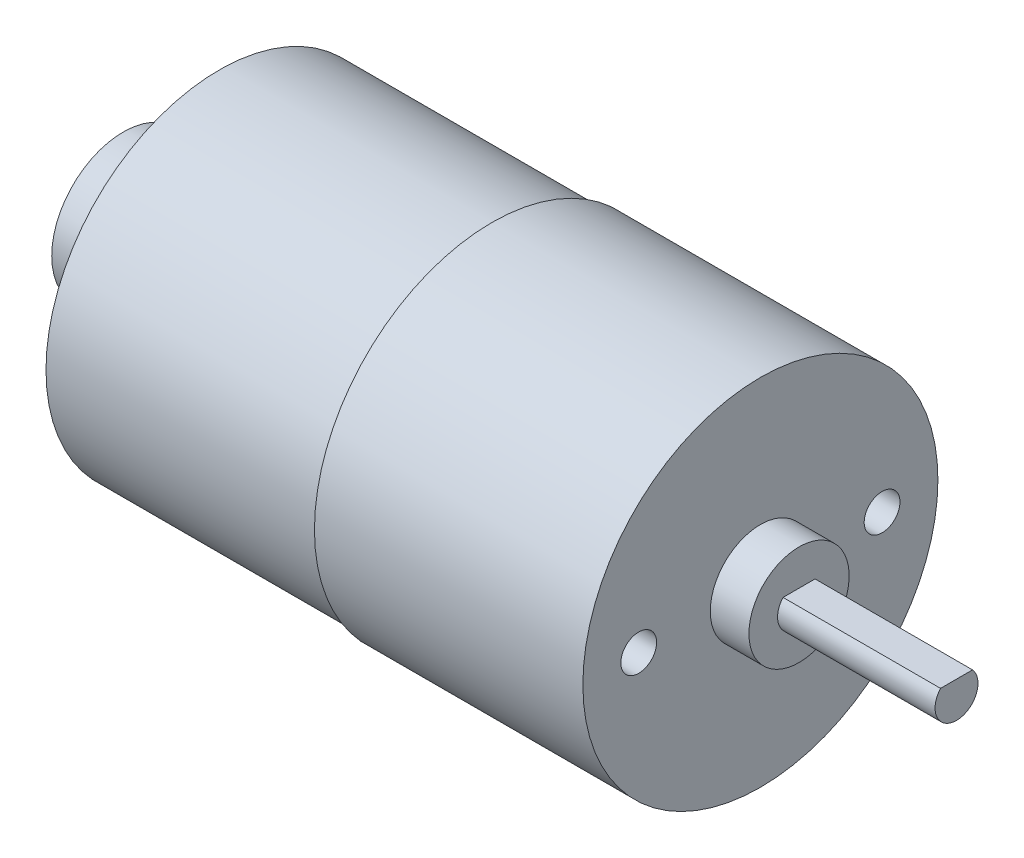
ISO-10303-21;
HEADER;
FILE_DESCRIPTION(('STEP AP214'),'2;1');
FILE_NAME('part.step','',(''),(''),'','','');
FILE_SCHEMA(('AUTOMOTIVE_DESIGN { 1 0 10303 214 1 1 1 1 }'));
ENDSEC;
DATA;
#1=APPLICATION_CONTEXT('core data for automotive mechanical design processes');
#2=APPLICATION_PROTOCOL_DEFINITION('international standard','automotive_design',2000,#1);
#3=PRODUCT_CONTEXT('',#1,'mechanical');
#4=PRODUCT('Part','Part','',(#3));
#5=PRODUCT_RELATED_PRODUCT_CATEGORY('part','',(#4));
#6=PRODUCT_DEFINITION_FORMATION('','',#4);
#7=PRODUCT_DEFINITION_CONTEXT('part definition',#1,'design');
#8=PRODUCT_DEFINITION('design','',#6,#7);
#9=PRODUCT_DEFINITION_SHAPE('','',#8);
#10=(LENGTH_UNIT() NAMED_UNIT(*) SI_UNIT(.MILLI.,.METRE.));
#11=(NAMED_UNIT(*) PLANE_ANGLE_UNIT() SI_UNIT($,.RADIAN.));
#12=(NAMED_UNIT(*) SI_UNIT($,.STERADIAN.) SOLID_ANGLE_UNIT());
#13=UNCERTAINTY_MEASURE_WITH_UNIT(LENGTH_MEASURE(1.E-05),#10,'distance_accuracy_value','');
#14=(GEOMETRIC_REPRESENTATION_CONTEXT(3) GLOBAL_UNCERTAINTY_ASSIGNED_CONTEXT((#13)) GLOBAL_UNIT_ASSIGNED_CONTEXT((#10,
#11,#12)) REPRESENTATION_CONTEXT('',''));
#15=CARTESIAN_POINT('',(0.,0.,0.));
#16=DIRECTION('',(0.,0.,1.));
#17=DIRECTION('',(1.,0.,0.));
#18=AXIS2_PLACEMENT_3D('',#15,#16,#17);
#19=CARTESIAN_POINT('',(37.8,12.4,0.));
#20=DIRECTION('',(-1.,0.,0.));
#21=DIRECTION('',(0.,0.,1.));
#22=AXIS2_PLACEMENT_3D('',#19,#20,#21);
#23=PLANE('',#22);
#24=CARTESIAN_POINT('',(37.8,0.,-8.5));
#25=DIRECTION('',(1.,0.,0.));
#26=DIRECTION('',(0.,0.,-1.));
#27=AXIS2_PLACEMENT_3D('',#24,#25,#26);
#28=CIRCLE('',#27,1.24999999999999);
#29=CARTESIAN_POINT('',(37.8,0.,-9.74999999999999));
#30=VERTEX_POINT('',#29);
#31=EDGE_CURVE('E84',#30,#30,#28,.T.);
#32=ORIENTED_EDGE('',*,*,#31,.F.);
#33=EDGE_LOOP('',(#32));
#34=FACE_BOUND('',#33,.T.);
#35=CARTESIAN_POINT('',(37.8,0.,0.));
#36=DIRECTION('',(-1.,0.,0.));
#37=DIRECTION('',(0.,0.,1.));
#38=AXIS2_PLACEMENT_3D('',#35,#36,#37);
#39=CIRCLE('',#38,12.4);
#40=CARTESIAN_POINT('',(37.8,0.,12.4));
#41=VERTEX_POINT('',#40);
#42=EDGE_CURVE('E100',#41,#41,#39,.T.);
#43=ORIENTED_EDGE('',*,*,#42,.F.);
#44=EDGE_LOOP('',(#43));
#45=FACE_BOUND('',#44,.T.);
#46=CARTESIAN_POINT('',(37.8,0.,0.));
#47=DIRECTION('',(-1.,0.,0.));
#48=DIRECTION('',(0.,0.,1.));
#49=AXIS2_PLACEMENT_3D('',#46,#47,#48);
#50=CIRCLE('',#49,3.5);
#51=CARTESIAN_POINT('',(37.8,0.,3.5));
#52=VERTEX_POINT('',#51);
#53=EDGE_CURVE('E97',#52,#52,#50,.T.);
#54=ORIENTED_EDGE('',*,*,#53,.T.);
#55=EDGE_LOOP('',(#54));
#56=FACE_BOUND('',#55,.T.);
#57=CARTESIAN_POINT('',(37.8,0.,8.5));
#58=DIRECTION('',(1.,0.,0.));
#59=DIRECTION('',(0.,0.,-1.));
#60=AXIS2_PLACEMENT_3D('',#57,#58,#59);
#61=CIRCLE('',#60,1.24999999999999);
#62=CARTESIAN_POINT('',(37.8,0.,7.25000000000001));
#63=VERTEX_POINT('',#62);
#64=EDGE_CURVE('E150',#63,#63,#61,.T.);
#65=ORIENTED_EDGE('',*,*,#64,.F.);
#66=EDGE_LOOP('',(#65));
#67=FACE_BOUND('',#66,.T.);
#68=ADVANCED_FACE('F45',(#34,#45,#56,#67),#23,.F.);
#69=CARTESIAN_POINT('',(0.,0.,0.));
#70=DIRECTION('',(1.,0.,0.));
#71=DIRECTION('',(0.,0.,-1.));
#72=AXIS2_PLACEMENT_3D('',#69,#70,#71);
#73=PLANE('',#72);
#74=CARTESIAN_POINT('',(0.,0.,0.));
#75=DIRECTION('',(-1.,0.,0.));
#76=DIRECTION('',(0.,0.,1.));
#77=AXIS2_PLACEMENT_3D('',#74,#75,#76);
#78=CIRCLE('',#77,5.);
#79=CARTESIAN_POINT('',(0.,0.,5.));
#80=VERTEX_POINT('',#79);
#81=EDGE_CURVE('E11',#80,#80,#78,.T.);
#82=ORIENTED_EDGE('',*,*,#81,.F.);
#83=EDGE_LOOP('',(#82));
#84=FACE_BOUND('',#83,.T.);
#85=CARTESIAN_POINT('',(0.,0.,0.));
#86=DIRECTION('',(-1.,0.,0.));
#87=DIRECTION('',(0.,0.,1.));
#88=AXIS2_PLACEMENT_3D('',#85,#86,#87);
#89=CIRCLE('',#88,12.1);
#90=CARTESIAN_POINT('',(0.,0.,12.1));
#91=VERTEX_POINT('',#90);
#92=EDGE_CURVE('E49',#91,#91,#89,.T.);
#93=ORIENTED_EDGE('',*,*,#92,.T.);
#94=EDGE_LOOP('',(#93));
#95=FACE_BOUND('',#94,.T.);
#96=ADVANCED_FACE('F47',(#84,#95),#73,.F.);
#97=CARTESIAN_POINT('',(0.,0.,0.));
#98=DIRECTION('',(-1.,0.,0.));
#99=DIRECTION('',(0.,0.,1.));
#100=AXIS2_PLACEMENT_3D('',#97,#98,#99);
#101=CYLINDRICAL_SURFACE('',#100,12.1);
#102=ORIENTED_EDGE('',*,*,#92,.F.);
#103=EDGE_LOOP('',(#102));
#104=FACE_BOUND('',#103,.T.);
#105=CARTESIAN_POINT('',(19.05,0.,0.));
#106=DIRECTION('',(-1.,0.,0.));
#107=DIRECTION('',(0.,0.,1.));
#108=AXIS2_PLACEMENT_3D('',#105,#106,#107);
#109=CIRCLE('',#108,12.1);
#110=CARTESIAN_POINT('',(19.05,0.,12.1));
#111=VERTEX_POINT('',#110);
#112=EDGE_CURVE('E105',#111,#111,#109,.T.);
#113=ORIENTED_EDGE('',*,*,#112,.T.);
#114=EDGE_LOOP('',(#113));
#115=FACE_BOUND('',#114,.T.);
#116=ADVANCED_FACE('F113',(#104,#115),#101,.T.);
#117=CARTESIAN_POINT('',(19.05,12.1,0.));
#118=DIRECTION('',(1.,0.,0.));
#119=DIRECTION('',(0.,0.,-1.));
#120=AXIS2_PLACEMENT_3D('',#117,#118,#119);
#121=PLANE('',#120);
#122=ORIENTED_EDGE('',*,*,#112,.F.);
#123=EDGE_LOOP('',(#122));
#124=FACE_BOUND('',#123,.T.);
#125=CARTESIAN_POINT('',(19.05,0.,0.));
#126=DIRECTION('',(-1.,0.,0.));
#127=DIRECTION('',(0.,0.,1.));
#128=AXIS2_PLACEMENT_3D('',#125,#126,#127);
#129=CIRCLE('',#128,12.4);
#130=CARTESIAN_POINT('',(19.05,0.,12.4));
#131=VERTEX_POINT('',#130);
#132=EDGE_CURVE('E103',#131,#131,#129,.T.);
#133=ORIENTED_EDGE('',*,*,#132,.T.);
#134=EDGE_LOOP('',(#133));
#135=FACE_BOUND('',#134,.T.);
#136=ADVANCED_FACE('F115',(#124,#135),#121,.F.);
#137=CARTESIAN_POINT('',(0.,0.,0.));
#138=DIRECTION('',(-1.,0.,0.));
#139=DIRECTION('',(0.,0.,1.));
#140=AXIS2_PLACEMENT_3D('',#137,#138,#139);
#141=CYLINDRICAL_SURFACE('',#140,12.4);
#142=ORIENTED_EDGE('',*,*,#132,.F.);
#143=EDGE_LOOP('',(#142));
#144=FACE_BOUND('',#143,.T.);
#145=ORIENTED_EDGE('',*,*,#42,.T.);
#146=EDGE_LOOP('',(#145));
#147=FACE_BOUND('',#146,.T.);
#148=ADVANCED_FACE('F120',(#144,#147),#141,.T.);
#149=CARTESIAN_POINT('',(0.,0.,0.));
#150=DIRECTION('',(-1.,0.,0.));
#151=DIRECTION('',(0.,0.,1.));
#152=AXIS2_PLACEMENT_3D('',#149,#150,#151);
#153=CYLINDRICAL_SURFACE('',#152,3.5);
#154=ORIENTED_EDGE('',*,*,#53,.F.);
#155=EDGE_LOOP('',(#154));
#156=FACE_BOUND('',#155,.T.);
#157=CARTESIAN_POINT('',(40.5,0.,0.));
#158=DIRECTION('',(-1.,0.,0.));
#159=DIRECTION('',(0.,0.,1.));
#160=AXIS2_PLACEMENT_3D('',#157,#158,#159);
#161=CIRCLE('',#160,3.5);
#162=CARTESIAN_POINT('',(40.5,0.,3.5));
#163=VERTEX_POINT('',#162);
#164=EDGE_CURVE('E89',#163,#163,#161,.T.);
#165=ORIENTED_EDGE('',*,*,#164,.T.);
#166=EDGE_LOOP('',(#165));
#167=FACE_BOUND('',#166,.T.);
#168=ADVANCED_FACE('F133',(#156,#167),#153,.T.);
#169=CARTESIAN_POINT('',(40.5,3.5,0.));
#170=DIRECTION('',(-1.,0.,0.));
#171=DIRECTION('',(0.,0.,1.));
#172=AXIS2_PLACEMENT_3D('',#169,#170,#171);
#173=PLANE('',#172);
#174=ORIENTED_EDGE('',*,*,#164,.F.);
#175=EDGE_LOOP('',(#174));
#176=FACE_BOUND('',#175,.T.);
#177=CARTESIAN_POINT('',(40.5,0.,0.));
#178=DIRECTION('',(-1.,0.,0.));
#179=DIRECTION('',(0.,0.,1.));
#180=AXIS2_PLACEMENT_3D('',#177,#178,#179);
#181=CIRCLE('',#180,1.5);
#182=CARTESIAN_POINT('',(40.5,1.,-1.1180339887499));
#183=VERTEX_POINT('',#182);
#184=CARTESIAN_POINT('',(40.5,1.,1.1180339887499));
#185=VERTEX_POINT('',#184);
#186=EDGE_CURVE('E83',#183,#185,#181,.T.);
#187=ORIENTED_EDGE('',*,*,#186,.T.);
#188=DIRECTION('',(0.,0.,-1.));
#189=VECTOR('',#188,1.);
#190=CARTESIAN_POINT('',(40.5,1.,1.1180339887499));
#191=LINE('',#190,#189);
#192=EDGE_CURVE('E76',#185,#183,#191,.T.);
#193=ORIENTED_EDGE('',*,*,#192,.T.);
#194=EDGE_LOOP('',(#187,#193));
#195=FACE_BOUND('',#194,.T.);
#196=ADVANCED_FACE('F140',(#176,#195),#173,.F.);
#197=CARTESIAN_POINT('',(0.,0.,0.));
#198=DIRECTION('',(-1.,0.,0.));
#199=DIRECTION('',(0.,0.,1.));
#200=AXIS2_PLACEMENT_3D('',#197,#198,#199);
#201=CYLINDRICAL_SURFACE('',#200,1.5);
#202=CARTESIAN_POINT('',(51.5,0.,0.));
#203=DIRECTION('',(-1.,0.,0.));
#204=DIRECTION('',(0.,0.,1.));
#205=AXIS2_PLACEMENT_3D('',#202,#203,#204);
#206=CIRCLE('',#205,1.5);
#207=CARTESIAN_POINT('',(51.5,1.,-1.1180339887499));
#208=VERTEX_POINT('',#207);
#209=CARTESIAN_POINT('',(51.5,1.,1.11803398874989));
#210=VERTEX_POINT('',#209);
#211=EDGE_CURVE('E81',#208,#210,#206,.T.);
#212=ORIENTED_EDGE('',*,*,#211,.T.);
#213=DIRECTION('',(1.,0.,0.));
#214=VECTOR('',#213,1.);
#215=CARTESIAN_POINT('',(40.5,1.,1.1180339887499));
#216=LINE('',#215,#214);
#217=EDGE_CURVE('E74',#185,#210,#216,.T.);
#218=ORIENTED_EDGE('',*,*,#217,.F.);
#219=ORIENTED_EDGE('',*,*,#186,.F.);
#220=DIRECTION('',(1.,0.,0.));
#221=VECTOR('',#220,1.);
#222=CARTESIAN_POINT('',(40.5,1.,-1.1180339887499));
#223=LINE('',#222,#221);
#224=EDGE_CURVE('E68',#183,#208,#223,.T.);
#225=ORIENTED_EDGE('',*,*,#224,.T.);
#226=EDGE_LOOP('',(#212,#218,#219,#225));
#227=FACE_BOUND('',#226,.T.);
#228=ADVANCED_FACE('F80',(#227),#201,.T.);
#229=CARTESIAN_POINT('',(51.5,1.5,0.));
#230=DIRECTION('',(-1.,0.,0.));
#231=DIRECTION('',(0.,0.,1.));
#232=AXIS2_PLACEMENT_3D('',#229,#230,#231);
#233=PLANE('',#232);
#234=ORIENTED_EDGE('',*,*,#211,.F.);
#235=DIRECTION('',(0.,0.,-1.));
#236=VECTOR('',#235,1.);
#237=CARTESIAN_POINT('',(51.5,1.,1.1180339887499));
#238=LINE('',#237,#236);
#239=EDGE_CURVE('E60',#210,#208,#238,.T.);
#240=ORIENTED_EDGE('',*,*,#239,.F.);
#241=EDGE_LOOP('',(#234,#240));
#242=FACE_BOUND('',#241,.T.);
#243=ADVANCED_FACE('F86',(#242),#233,.F.);
#244=CARTESIAN_POINT('',(-6.7,0.,0.));
#245=DIRECTION('',(1.,0.,0.));
#246=DIRECTION('',(0.,0.,-1.));
#247=AXIS2_PLACEMENT_3D('',#244,#245,#246);
#248=CYLINDRICAL_SURFACE('',#247,5.);
#249=CARTESIAN_POINT('',(-6.7,0.,0.));
#250=DIRECTION('',(-1.,0.,0.));
#251=DIRECTION('',(0.,0.,1.));
#252=AXIS2_PLACEMENT_3D('',#249,#250,#251);
#253=CIRCLE('',#252,5.);
#254=CARTESIAN_POINT('',(-6.7,0.,5.));
#255=VERTEX_POINT('',#254);
#256=EDGE_CURVE('E87',#255,#255,#253,.T.);
#257=ORIENTED_EDGE('',*,*,#256,.F.);
#258=EDGE_LOOP('',(#257));
#259=FACE_BOUND('',#258,.T.);
#260=ORIENTED_EDGE('',*,*,#81,.T.);
#261=EDGE_LOOP('',(#260));
#262=FACE_BOUND('',#261,.T.);
#263=ADVANCED_FACE('F173',(#259,#262),#248,.T.);
#264=CARTESIAN_POINT('',(-6.7,0.,0.));
#265=DIRECTION('',(-1.,0.,0.));
#266=DIRECTION('',(0.,0.,1.));
#267=AXIS2_PLACEMENT_3D('',#264,#265,#266);
#268=PLANE('',#267);
#269=ORIENTED_EDGE('',*,*,#256,.T.);
#270=EDGE_LOOP('',(#269));
#271=FACE_BOUND('',#270,.T.);
#272=ADVANCED_FACE('F176',(#271),#268,.T.);
#273=CARTESIAN_POINT('',(32.8,0.,8.5));
#274=DIRECTION('',(-1.,0.,0.));
#275=DIRECTION('',(0.,0.,1.));
#276=AXIS2_PLACEMENT_3D('',#273,#274,#275);
#277=PLANE('',#276);
#278=CARTESIAN_POINT('',(32.8,0.,8.5));
#279=DIRECTION('',(1.,0.,0.));
#280=DIRECTION('',(0.,0.,-1.));
#281=AXIS2_PLACEMENT_3D('',#278,#279,#280);
#282=CIRCLE('',#281,1.25);
#283=CARTESIAN_POINT('',(32.8,0.,7.25));
#284=VERTEX_POINT('',#283);
#285=EDGE_CURVE('E92',#284,#284,#282,.T.);
#286=ORIENTED_EDGE('',*,*,#285,.T.);
#287=EDGE_LOOP('',(#286));
#288=FACE_BOUND('',#287,.T.);
#289=ADVANCED_FACE('F180',(#288),#277,.F.);
#290=CARTESIAN_POINT('',(37.8,0.,8.5));
#291=DIRECTION('',(1.,0.,0.));
#292=DIRECTION('',(0.,0.,-1.));
#293=AXIS2_PLACEMENT_3D('',#290,#291,#292);
#294=CYLINDRICAL_SURFACE('',#293,1.24999999999999);
#295=ORIENTED_EDGE('',*,*,#285,.F.);
#296=EDGE_LOOP('',(#295));
#297=FACE_BOUND('',#296,.T.);
#298=ORIENTED_EDGE('',*,*,#64,.T.);
#299=EDGE_LOOP('',(#298));
#300=FACE_BOUND('',#299,.T.);
#301=ADVANCED_FACE('F184',(#297,#300),#294,.F.);
#302=CARTESIAN_POINT('',(32.8,0.,-8.5));
#303=DIRECTION('',(-1.,0.,0.));
#304=DIRECTION('',(0.,0.,1.));
#305=AXIS2_PLACEMENT_3D('',#302,#303,#304);
#306=PLANE('',#305);
#307=CARTESIAN_POINT('',(32.8,0.,-8.5));
#308=DIRECTION('',(1.,0.,0.));
#309=DIRECTION('',(0.,0.,-1.));
#310=AXIS2_PLACEMENT_3D('',#307,#308,#309);
#311=CIRCLE('',#310,1.25);
#312=CARTESIAN_POINT('',(32.8,0.,-9.74999999999999));
#313=VERTEX_POINT('',#312);
#314=EDGE_CURVE('E152',#313,#313,#311,.T.);
#315=ORIENTED_EDGE('',*,*,#314,.T.);
#316=EDGE_LOOP('',(#315));
#317=FACE_BOUND('',#316,.T.);
#318=ADVANCED_FACE('F188',(#317),#306,.F.);
#319=CARTESIAN_POINT('',(37.8,0.,-8.5));
#320=DIRECTION('',(1.,0.,0.));
#321=DIRECTION('',(0.,0.,-1.));
#322=AXIS2_PLACEMENT_3D('',#319,#320,#321);
#323=CYLINDRICAL_SURFACE('',#322,1.24999999999999);
#324=ORIENTED_EDGE('',*,*,#314,.F.);
#325=EDGE_LOOP('',(#324));
#326=FACE_BOUND('',#325,.T.);
#327=ORIENTED_EDGE('',*,*,#31,.T.);
#328=EDGE_LOOP('',(#327));
#329=FACE_BOUND('',#328,.T.);
#330=ADVANCED_FACE('F192',(#326,#329),#323,.F.);
#331=CARTESIAN_POINT('',(40.5,1.,1.1180339887499));
#332=DIRECTION('',(0.,-1.,0.));
#333=DIRECTION('',(0.,0.,-1.));
#334=AXIS2_PLACEMENT_3D('',#331,#332,#333);
#335=PLANE('',#334);
#336=ORIENTED_EDGE('',*,*,#239,.T.);
#337=ORIENTED_EDGE('',*,*,#224,.F.);
#338=ORIENTED_EDGE('',*,*,#192,.F.);
#339=ORIENTED_EDGE('',*,*,#217,.T.);
#340=EDGE_LOOP('',(#336,#337,#338,#339));
#341=FACE_BOUND('',#340,.T.);
#342=ADVANCED_FACE('F73',(#341),#335,.F.);
#343=CLOSED_SHELL('',(#68,#96,#116,#136,#148,#168,#196,#228,#243,#263,#272,#289,#301,#318,#330,#342));
#344=MANIFOLD_SOLID_BREP('B2',#343);
#345=ADVANCED_BREP_SHAPE_REPRESENTATION('',(#18,#344),#14);
#346=SHAPE_DEFINITION_REPRESENTATION(#9,#345);
ENDSEC;
END-ISO-10303-21;
